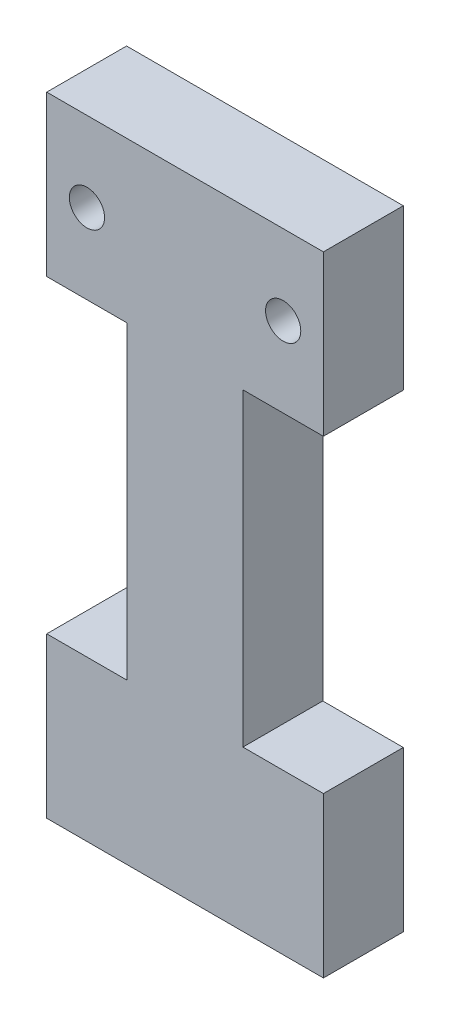
ISO-10303-21;
HEADER;
FILE_DESCRIPTION(('STEP AP214'),'2;1');
FILE_NAME('part.step','',(''),(''),'','','');
FILE_SCHEMA(('AUTOMOTIVE_DESIGN { 1 0 10303 214 1 1 1 1 }'));
ENDSEC;
DATA;
#1=APPLICATION_CONTEXT('core data for automotive mechanical design processes');
#2=APPLICATION_PROTOCOL_DEFINITION('international standard','automotive_design',2000,#1);
#3=PRODUCT_CONTEXT('',#1,'mechanical');
#4=PRODUCT('Part','Part','',(#3));
#5=PRODUCT_RELATED_PRODUCT_CATEGORY('part','',(#4));
#6=PRODUCT_DEFINITION_FORMATION('','',#4);
#7=PRODUCT_DEFINITION_CONTEXT('part definition',#1,'design');
#8=PRODUCT_DEFINITION('design','',#6,#7);
#9=PRODUCT_DEFINITION_SHAPE('','',#8);
#10=(LENGTH_UNIT() NAMED_UNIT(*) SI_UNIT(.MILLI.,.METRE.));
#11=(NAMED_UNIT(*) PLANE_ANGLE_UNIT() SI_UNIT($,.RADIAN.));
#12=(NAMED_UNIT(*) SI_UNIT($,.STERADIAN.) SOLID_ANGLE_UNIT());
#13=UNCERTAINTY_MEASURE_WITH_UNIT(LENGTH_MEASURE(1.E-05),#10,'distance_accuracy_value','');
#14=(GEOMETRIC_REPRESENTATION_CONTEXT(3) GLOBAL_UNCERTAINTY_ASSIGNED_CONTEXT((#13)) GLOBAL_UNIT_ASSIGNED_CONTEXT((#10,
#11,#12)) REPRESENTATION_CONTEXT('',''));
#15=CARTESIAN_POINT('',(0.,0.,0.));
#16=DIRECTION('',(0.,0.,1.));
#17=DIRECTION('',(1.,0.,0.));
#18=AXIS2_PLACEMENT_3D('',#15,#16,#17);
#19=CARTESIAN_POINT('',(0.,-25.,6.35));
#20=DIRECTION('',(0.,1.,0.));
#21=DIRECTION('',(-1.,0.,0.));
#22=AXIS2_PLACEMENT_3D('',#19,#20,#21);
#23=PLANE('',#22);
#24=DIRECTION('',(1.,0.,0.));
#25=VECTOR('',#24,1.);
#26=CARTESIAN_POINT('',(0.,-25.,0.));
#27=LINE('',#26,#25);
#28=CARTESIAN_POINT('',(-11.,-25.,0.));
#29=VERTEX_POINT('',#28);
#30=CARTESIAN_POINT('',(11.,-25.,0.));
#31=VERTEX_POINT('',#30);
#32=EDGE_CURVE('E166',#29,#31,#27,.T.);
#33=ORIENTED_EDGE('',*,*,#32,.T.);
#34=DIRECTION('',(0.,0.,-1.));
#35=VECTOR('',#34,1.);
#36=CARTESIAN_POINT('',(11.,-25.,6.35));
#37=LINE('',#36,#35);
#38=CARTESIAN_POINT('',(11.,-25.,6.35));
#39=VERTEX_POINT('',#38);
#40=EDGE_CURVE('E11',#39,#31,#37,.T.);
#41=ORIENTED_EDGE('',*,*,#40,.F.);
#42=DIRECTION('',(1.,0.,0.));
#43=VECTOR('',#42,1.);
#44=CARTESIAN_POINT('',(0.,-25.,6.35));
#45=LINE('',#44,#43);
#46=CARTESIAN_POINT('',(-11.,-25.,6.35));
#47=VERTEX_POINT('',#46);
#48=EDGE_CURVE('E202',#47,#39,#45,.T.);
#49=ORIENTED_EDGE('',*,*,#48,.F.);
#50=DIRECTION('',(0.,0.,-1.));
#51=VECTOR('',#50,1.);
#52=CARTESIAN_POINT('',(-11.,-25.,6.35));
#53=LINE('',#52,#51);
#54=EDGE_CURVE('E53',#47,#29,#53,.T.);
#55=ORIENTED_EDGE('',*,*,#54,.T.);
#56=EDGE_LOOP('',(#33,#41,#49,#55));
#57=FACE_BOUND('',#56,.T.);
#58=ADVANCED_FACE('F37',(#57),#23,.F.);
#59=CARTESIAN_POINT('',(11.,0.,6.35));
#60=DIRECTION('',(-1.,0.,0.));
#61=DIRECTION('',(0.,-1.,0.));
#62=AXIS2_PLACEMENT_3D('',#59,#60,#61);
#63=PLANE('',#62);
#64=DIRECTION('',(0.,1.,0.));
#65=VECTOR('',#64,1.);
#66=CARTESIAN_POINT('',(11.,0.,0.));
#67=LINE('',#66,#65);
#68=CARTESIAN_POINT('',(11.,-12.3,0.));
#69=VERTEX_POINT('',#68);
#70=EDGE_CURVE('E168',#31,#69,#67,.T.);
#71=ORIENTED_EDGE('',*,*,#70,.T.);
#72=DIRECTION('',(0.,0.,-1.));
#73=VECTOR('',#72,1.);
#74=CARTESIAN_POINT('',(11.,-12.3,6.35));
#75=LINE('',#74,#73);
#76=CARTESIAN_POINT('',(11.,-12.3,6.35));
#77=VERTEX_POINT('',#76);
#78=EDGE_CURVE('E45',#77,#69,#75,.T.);
#79=ORIENTED_EDGE('',*,*,#78,.F.);
#80=DIRECTION('',(0.,1.,0.));
#81=VECTOR('',#80,1.);
#82=CARTESIAN_POINT('',(11.,0.,6.35));
#83=LINE('',#82,#81);
#84=EDGE_CURVE('E104',#39,#77,#83,.T.);
#85=ORIENTED_EDGE('',*,*,#84,.F.);
#86=ORIENTED_EDGE('',*,*,#40,.T.);
#87=EDGE_LOOP('',(#71,#79,#85,#86));
#88=FACE_BOUND('',#87,.T.);
#89=ADVANCED_FACE('F225',(#88),#63,.F.);
#90=CARTESIAN_POINT('',(0.,-12.3,6.35));
#91=DIRECTION('',(0.,1.,0.));
#92=DIRECTION('',(0.,0.,1.));
#93=AXIS2_PLACEMENT_3D('',#90,#91,#92);
#94=PLANE('',#93);
#95=DIRECTION('',(1.,0.,0.));
#96=VECTOR('',#95,1.);
#97=CARTESIAN_POINT('',(0.,-12.3,0.));
#98=LINE('',#97,#96);
#99=CARTESIAN_POINT('',(4.6,-12.3,0.));
#100=VERTEX_POINT('',#99);
#101=EDGE_CURVE('E171',#100,#69,#98,.T.);
#102=ORIENTED_EDGE('',*,*,#101,.F.);
#103=DIRECTION('',(0.,0.,-1.));
#104=VECTOR('',#103,1.);
#105=CARTESIAN_POINT('',(4.6,-12.3,6.35));
#106=LINE('',#105,#104);
#107=CARTESIAN_POINT('',(4.6,-12.3,6.35));
#108=VERTEX_POINT('',#107);
#109=EDGE_CURVE('E218',#108,#100,#106,.T.);
#110=ORIENTED_EDGE('',*,*,#109,.F.);
#111=DIRECTION('',(1.,0.,0.));
#112=VECTOR('',#111,1.);
#113=CARTESIAN_POINT('',(0.,-12.3,6.35));
#114=LINE('',#113,#112);
#115=EDGE_CURVE('E224',#108,#77,#114,.T.);
#116=ORIENTED_EDGE('',*,*,#115,.T.);
#117=ORIENTED_EDGE('',*,*,#78,.T.);
#118=EDGE_LOOP('',(#102,#110,#116,#117));
#119=FACE_BOUND('',#118,.T.);
#120=ADVANCED_FACE('F222',(#119),#94,.T.);
#121=CARTESIAN_POINT('',(4.6,0.,6.35));
#122=DIRECTION('',(-1.,0.,0.));
#123=DIRECTION('',(0.,-1.,0.));
#124=AXIS2_PLACEMENT_3D('',#121,#122,#123);
#125=PLANE('',#124);
#126=DIRECTION('',(0.,1.,0.));
#127=VECTOR('',#126,1.);
#128=CARTESIAN_POINT('',(4.6,0.,0.));
#129=LINE('',#128,#127);
#130=CARTESIAN_POINT('',(4.6,12.3,0.));
#131=VERTEX_POINT('',#130);
#132=EDGE_CURVE('E174',#100,#131,#129,.T.);
#133=ORIENTED_EDGE('',*,*,#132,.T.);
#134=DIRECTION('',(0.,0.,-1.));
#135=VECTOR('',#134,1.);
#136=CARTESIAN_POINT('',(4.6,12.3,6.35));
#137=LINE('',#136,#135);
#138=CARTESIAN_POINT('',(4.6,12.3,6.35));
#139=VERTEX_POINT('',#138);
#140=EDGE_CURVE('E215',#139,#131,#137,.T.);
#141=ORIENTED_EDGE('',*,*,#140,.F.);
#142=DIRECTION('',(0.,1.,0.));
#143=VECTOR('',#142,1.);
#144=CARTESIAN_POINT('',(4.6,0.,6.35));
#145=LINE('',#144,#143);
#146=EDGE_CURVE('E244',#108,#139,#145,.T.);
#147=ORIENTED_EDGE('',*,*,#146,.F.);
#148=ORIENTED_EDGE('',*,*,#109,.T.);
#149=EDGE_LOOP('',(#133,#141,#147,#148));
#150=FACE_BOUND('',#149,.T.);
#151=ADVANCED_FACE('F234',(#150),#125,.F.);
#152=CARTESIAN_POINT('',(0.,12.3,6.35));
#153=DIRECTION('',(0.,1.,0.));
#154=DIRECTION('',(0.,0.,1.));
#155=AXIS2_PLACEMENT_3D('',#152,#153,#154);
#156=PLANE('',#155);
#157=DIRECTION('',(1.,0.,0.));
#158=VECTOR('',#157,1.);
#159=CARTESIAN_POINT('',(0.,12.3,0.));
#160=LINE('',#159,#158);
#161=CARTESIAN_POINT('',(11.,12.3,0.));
#162=VERTEX_POINT('',#161);
#163=EDGE_CURVE('E176',#131,#162,#160,.T.);
#164=ORIENTED_EDGE('',*,*,#163,.T.);
#165=DIRECTION('',(0.,0.,-1.));
#166=VECTOR('',#165,1.);
#167=CARTESIAN_POINT('',(11.,12.3,6.35));
#168=LINE('',#167,#166);
#169=CARTESIAN_POINT('',(11.,12.3,6.35));
#170=VERTEX_POINT('',#169);
#171=EDGE_CURVE('E213',#170,#162,#168,.T.);
#172=ORIENTED_EDGE('',*,*,#171,.F.);
#173=DIRECTION('',(1.,0.,0.));
#174=VECTOR('',#173,1.);
#175=CARTESIAN_POINT('',(0.,12.3,6.35));
#176=LINE('',#175,#174);
#177=EDGE_CURVE('E240',#139,#170,#176,.T.);
#178=ORIENTED_EDGE('',*,*,#177,.F.);
#179=ORIENTED_EDGE('',*,*,#140,.T.);
#180=EDGE_LOOP('',(#164,#172,#178,#179));
#181=FACE_BOUND('',#180,.T.);
#182=ADVANCED_FACE('F238',(#181),#156,.F.);
#183=CARTESIAN_POINT('',(11.,0.,6.35));
#184=DIRECTION('',(1.,0.,0.));
#185=DIRECTION('',(0.,1.,0.));
#186=AXIS2_PLACEMENT_3D('',#183,#184,#185);
#187=PLANE('',#186);
#188=DIRECTION('',(0.,-1.,0.));
#189=VECTOR('',#188,1.);
#190=CARTESIAN_POINT('',(11.,0.,0.));
#191=LINE('',#190,#189);
#192=CARTESIAN_POINT('',(11.,25.,0.));
#193=VERTEX_POINT('',#192);
#194=EDGE_CURVE('E179',#193,#162,#191,.T.);
#195=ORIENTED_EDGE('',*,*,#194,.F.);
#196=DIRECTION('',(0.,0.,-1.));
#197=VECTOR('',#196,1.);
#198=CARTESIAN_POINT('',(11.,25.,6.35));
#199=LINE('',#198,#197);
#200=CARTESIAN_POINT('',(11.,25.,6.35));
#201=VERTEX_POINT('',#200);
#202=EDGE_CURVE('E211',#201,#193,#199,.T.);
#203=ORIENTED_EDGE('',*,*,#202,.F.);
#204=DIRECTION('',(0.,-1.,0.));
#205=VECTOR('',#204,1.);
#206=CARTESIAN_POINT('',(11.,0.,6.35));
#207=LINE('',#206,#205);
#208=EDGE_CURVE('E243',#201,#170,#207,.T.);
#209=ORIENTED_EDGE('',*,*,#208,.T.);
#210=ORIENTED_EDGE('',*,*,#171,.T.);
#211=EDGE_LOOP('',(#195,#203,#209,#210));
#212=FACE_BOUND('',#211,.T.);
#213=ADVANCED_FACE('F290',(#212),#187,.T.);
#214=CARTESIAN_POINT('',(0.,25.,6.35));
#215=DIRECTION('',(0.,-1.,0.));
#216=DIRECTION('',(0.,0.,-1.));
#217=AXIS2_PLACEMENT_3D('',#214,#215,#216);
#218=PLANE('',#217);
#219=DIRECTION('',(-1.,0.,0.));
#220=VECTOR('',#219,1.);
#221=CARTESIAN_POINT('',(0.,25.,0.));
#222=LINE('',#221,#220);
#223=CARTESIAN_POINT('',(-11.,25.,0.));
#224=VERTEX_POINT('',#223);
#225=EDGE_CURVE('E182',#193,#224,#222,.T.);
#226=ORIENTED_EDGE('',*,*,#225,.T.);
#227=DIRECTION('',(0.,0.,-1.));
#228=VECTOR('',#227,1.);
#229=CARTESIAN_POINT('',(-11.,25.,6.35));
#230=LINE('',#229,#228);
#231=CARTESIAN_POINT('',(-11.,25.,6.35));
#232=VERTEX_POINT('',#231);
#233=EDGE_CURVE('E208',#232,#224,#230,.T.);
#234=ORIENTED_EDGE('',*,*,#233,.F.);
#235=DIRECTION('',(-1.,0.,0.));
#236=VECTOR('',#235,1.);
#237=CARTESIAN_POINT('',(0.,25.,6.35));
#238=LINE('',#237,#236);
#239=EDGE_CURVE('E246',#201,#232,#238,.T.);
#240=ORIENTED_EDGE('',*,*,#239,.F.);
#241=ORIENTED_EDGE('',*,*,#202,.T.);
#242=EDGE_LOOP('',(#226,#234,#240,#241));
#243=FACE_BOUND('',#242,.T.);
#244=ADVANCED_FACE('F293',(#243),#218,.F.);
#245=CARTESIAN_POINT('',(-11.,0.,6.35));
#246=DIRECTION('',(1.,0.,0.));
#247=DIRECTION('',(0.,1.,0.));
#248=AXIS2_PLACEMENT_3D('',#245,#246,#247);
#249=PLANE('',#248);
#250=DIRECTION('',(0.,-1.,0.));
#251=VECTOR('',#250,1.);
#252=CARTESIAN_POINT('',(-11.,0.,0.));
#253=LINE('',#252,#251);
#254=CARTESIAN_POINT('',(-11.,12.3,0.));
#255=VERTEX_POINT('',#254);
#256=EDGE_CURVE('E184',#224,#255,#253,.T.);
#257=ORIENTED_EDGE('',*,*,#256,.T.);
#258=DIRECTION('',(0.,0.,-1.));
#259=VECTOR('',#258,1.);
#260=CARTESIAN_POINT('',(-11.,12.3,6.35));
#261=LINE('',#260,#259);
#262=CARTESIAN_POINT('',(-11.,12.3,6.35));
#263=VERTEX_POINT('',#262);
#264=EDGE_CURVE('E206',#263,#255,#261,.T.);
#265=ORIENTED_EDGE('',*,*,#264,.F.);
#266=DIRECTION('',(0.,-1.,0.));
#267=VECTOR('',#266,1.);
#268=CARTESIAN_POINT('',(-11.,0.,6.35));
#269=LINE('',#268,#267);
#270=EDGE_CURVE('E155',#232,#263,#269,.T.);
#271=ORIENTED_EDGE('',*,*,#270,.F.);
#272=ORIENTED_EDGE('',*,*,#233,.T.);
#273=EDGE_LOOP('',(#257,#265,#271,#272));
#274=FACE_BOUND('',#273,.T.);
#275=ADVANCED_FACE('F256',(#274),#249,.F.);
#276=CARTESIAN_POINT('',(0.,12.3,6.35));
#277=DIRECTION('',(0.,-1.,0.));
#278=DIRECTION('',(1.,0.,0.));
#279=AXIS2_PLACEMENT_3D('',#276,#277,#278);
#280=PLANE('',#279);
#281=DIRECTION('',(-1.,0.,0.));
#282=VECTOR('',#281,1.);
#283=CARTESIAN_POINT('',(0.,12.3,0.));
#284=LINE('',#283,#282);
#285=CARTESIAN_POINT('',(-4.6,12.3,0.));
#286=VERTEX_POINT('',#285);
#287=EDGE_CURVE('E187',#286,#255,#284,.T.);
#288=ORIENTED_EDGE('',*,*,#287,.F.);
#289=DIRECTION('',(0.,0.,-1.));
#290=VECTOR('',#289,1.);
#291=CARTESIAN_POINT('',(-4.6,12.3,6.35));
#292=LINE('',#291,#290);
#293=CARTESIAN_POINT('',(-4.6,12.3,6.35));
#294=VERTEX_POINT('',#293);
#295=EDGE_CURVE('E141',#294,#286,#292,.T.);
#296=ORIENTED_EDGE('',*,*,#295,.F.);
#297=DIRECTION('',(-1.,0.,0.));
#298=VECTOR('',#297,1.);
#299=CARTESIAN_POINT('',(0.,12.3,6.35));
#300=LINE('',#299,#298);
#301=EDGE_CURVE('E153',#294,#263,#300,.T.);
#302=ORIENTED_EDGE('',*,*,#301,.T.);
#303=ORIENTED_EDGE('',*,*,#264,.T.);
#304=EDGE_LOOP('',(#288,#296,#302,#303));
#305=FACE_BOUND('',#304,.T.);
#306=ADVANCED_FACE('F260',(#305),#280,.T.);
#307=CARTESIAN_POINT('',(-4.6,0.,6.35));
#308=DIRECTION('',(-1.,0.,0.));
#309=DIRECTION('',(0.,-1.,0.));
#310=AXIS2_PLACEMENT_3D('',#307,#308,#309);
#311=PLANE('',#310);
#312=DIRECTION('',(0.,1.,0.));
#313=VECTOR('',#312,1.);
#314=CARTESIAN_POINT('',(-4.6,0.,0.));
#315=LINE('',#314,#313);
#316=CARTESIAN_POINT('',(-4.6,-12.3,0.));
#317=VERTEX_POINT('',#316);
#318=EDGE_CURVE('E138',#317,#286,#315,.T.);
#319=ORIENTED_EDGE('',*,*,#318,.F.);
#320=DIRECTION('',(0.,0.,-1.));
#321=VECTOR('',#320,1.);
#322=CARTESIAN_POINT('',(-4.6,-12.3,6.35));
#323=LINE('',#322,#321);
#324=CARTESIAN_POINT('',(-4.6,-12.3,6.35));
#325=VERTEX_POINT('',#324);
#326=EDGE_CURVE('E132',#325,#317,#323,.T.);
#327=ORIENTED_EDGE('',*,*,#326,.F.);
#328=DIRECTION('',(0.,1.,0.));
#329=VECTOR('',#328,1.);
#330=CARTESIAN_POINT('',(-4.6,0.,6.35));
#331=LINE('',#330,#329);
#332=EDGE_CURVE('E136',#325,#294,#331,.T.);
#333=ORIENTED_EDGE('',*,*,#332,.T.);
#334=ORIENTED_EDGE('',*,*,#295,.T.);
#335=EDGE_LOOP('',(#319,#327,#333,#334));
#336=FACE_BOUND('',#335,.T.);
#337=ADVANCED_FACE('F134',(#336),#311,.T.);
#338=CARTESIAN_POINT('',(0.,-12.3,6.35));
#339=DIRECTION('',(0.,-1.,0.));
#340=DIRECTION('',(0.,0.,-1.));
#341=AXIS2_PLACEMENT_3D('',#338,#339,#340);
#342=PLANE('',#341);
#343=DIRECTION('',(-1.,0.,0.));
#344=VECTOR('',#343,1.);
#345=CARTESIAN_POINT('',(0.,-12.3,0.));
#346=LINE('',#345,#344);
#347=CARTESIAN_POINT('',(-11.,-12.3,0.));
#348=VERTEX_POINT('',#347);
#349=EDGE_CURVE('E191',#317,#348,#346,.T.);
#350=ORIENTED_EDGE('',*,*,#349,.T.);
#351=DIRECTION('',(0.,0.,-1.));
#352=VECTOR('',#351,1.);
#353=CARTESIAN_POINT('',(-11.,-12.3,6.35));
#354=LINE('',#353,#352);
#355=CARTESIAN_POINT('',(-11.,-12.3,6.35));
#356=VERTEX_POINT('',#355);
#357=EDGE_CURVE('E92',#356,#348,#354,.T.);
#358=ORIENTED_EDGE('',*,*,#357,.F.);
#359=DIRECTION('',(-1.,0.,0.));
#360=VECTOR('',#359,1.);
#361=CARTESIAN_POINT('',(0.,-12.3,6.35));
#362=LINE('',#361,#360);
#363=EDGE_CURVE('E143',#325,#356,#362,.T.);
#364=ORIENTED_EDGE('',*,*,#363,.F.);
#365=ORIENTED_EDGE('',*,*,#326,.T.);
#366=EDGE_LOOP('',(#350,#358,#364,#365));
#367=FACE_BOUND('',#366,.T.);
#368=ADVANCED_FACE('F144',(#367),#342,.F.);
#369=CARTESIAN_POINT('',(7.8,18.65,6.35));
#370=DIRECTION('',(0.,0.,-1.));
#371=DIRECTION('',(-1.,0.,0.));
#372=AXIS2_PLACEMENT_3D('',#369,#370,#371);
#373=CYLINDRICAL_SURFACE('',#372,1.4);
#374=CARTESIAN_POINT('',(7.8,18.65,6.35));
#375=DIRECTION('',(0.,0.,1.));
#376=DIRECTION('',(1.,0.,0.));
#377=AXIS2_PLACEMENT_3D('',#374,#375,#376);
#378=CIRCLE('',#377,1.4);
#379=CARTESIAN_POINT('',(9.2,18.65,6.35));
#380=VERTEX_POINT('',#379);
#381=EDGE_CURVE('E160',#380,#380,#378,.T.);
#382=ORIENTED_EDGE('',*,*,#381,.T.);
#383=EDGE_LOOP('',(#382));
#384=FACE_BOUND('',#383,.T.);
#385=CARTESIAN_POINT('',(7.8,18.65,0.));
#386=DIRECTION('',(0.,0.,1.));
#387=DIRECTION('',(1.,0.,0.));
#388=AXIS2_PLACEMENT_3D('',#385,#386,#387);
#389=CIRCLE('',#388,1.4);
#390=CARTESIAN_POINT('',(9.2,18.65,0.));
#391=VERTEX_POINT('',#390);
#392=EDGE_CURVE('E196',#391,#391,#389,.T.);
#393=ORIENTED_EDGE('',*,*,#392,.F.);
#394=EDGE_LOOP('',(#393));
#395=FACE_BOUND('',#394,.T.);
#396=ADVANCED_FACE('F264',(#384,#395),#373,.F.);
#397=CARTESIAN_POINT('',(-11.,0.,6.35));
#398=DIRECTION('',(-1.,0.,0.));
#399=DIRECTION('',(0.,0.,1.));
#400=AXIS2_PLACEMENT_3D('',#397,#398,#399);
#401=PLANE('',#400);
#402=DIRECTION('',(0.,1.,0.));
#403=VECTOR('',#402,1.);
#404=CARTESIAN_POINT('',(-11.,0.,0.));
#405=LINE('',#404,#403);
#406=EDGE_CURVE('E193',#29,#348,#405,.T.);
#407=ORIENTED_EDGE('',*,*,#406,.F.);
#408=ORIENTED_EDGE('',*,*,#54,.F.);
#409=DIRECTION('',(0.,1.,0.));
#410=VECTOR('',#409,1.);
#411=CARTESIAN_POINT('',(-11.,0.,6.35));
#412=LINE('',#411,#410);
#413=EDGE_CURVE('E147',#47,#356,#412,.T.);
#414=ORIENTED_EDGE('',*,*,#413,.T.);
#415=ORIENTED_EDGE('',*,*,#357,.T.);
#416=EDGE_LOOP('',(#407,#408,#414,#415));
#417=FACE_BOUND('',#416,.T.);
#418=ADVANCED_FACE('F261',(#417),#401,.T.);
#419=CARTESIAN_POINT('',(-7.8,18.65,6.35));
#420=DIRECTION('',(0.,0.,-1.));
#421=DIRECTION('',(-1.,0.,0.));
#422=AXIS2_PLACEMENT_3D('',#419,#420,#421);
#423=CYLINDRICAL_SURFACE('',#422,1.4);
#424=CARTESIAN_POINT('',(-7.8,18.65,6.35));
#425=DIRECTION('',(0.,0.,1.));
#426=DIRECTION('',(1.,0.,0.));
#427=AXIS2_PLACEMENT_3D('',#424,#425,#426);
#428=CIRCLE('',#427,1.4);
#429=CARTESIAN_POINT('',(-6.4,18.65,6.35));
#430=VERTEX_POINT('',#429);
#431=EDGE_CURVE('E163',#430,#430,#428,.T.);
#432=ORIENTED_EDGE('',*,*,#431,.T.);
#433=EDGE_LOOP('',(#432));
#434=FACE_BOUND('',#433,.T.);
#435=CARTESIAN_POINT('',(-7.8,18.65,0.));
#436=DIRECTION('',(0.,0.,1.));
#437=DIRECTION('',(1.,0.,0.));
#438=AXIS2_PLACEMENT_3D('',#435,#436,#437);
#439=CIRCLE('',#438,1.4);
#440=CARTESIAN_POINT('',(-6.4,18.65,0.));
#441=VERTEX_POINT('',#440);
#442=EDGE_CURVE('E199',#441,#441,#439,.T.);
#443=ORIENTED_EDGE('',*,*,#442,.F.);
#444=EDGE_LOOP('',(#443));
#445=FACE_BOUND('',#444,.T.);
#446=ADVANCED_FACE('F263',(#434,#445),#423,.F.);
#447=CARTESIAN_POINT('',(0.,0.,6.35));
#448=DIRECTION('',(0.,0.,1.));
#449=DIRECTION('',(1.,0.,0.));
#450=AXIS2_PLACEMENT_3D('',#447,#448,#449);
#451=PLANE('',#450);
#452=ORIENTED_EDGE('',*,*,#48,.T.);
#453=ORIENTED_EDGE('',*,*,#84,.T.);
#454=ORIENTED_EDGE('',*,*,#115,.F.);
#455=ORIENTED_EDGE('',*,*,#146,.T.);
#456=ORIENTED_EDGE('',*,*,#177,.T.);
#457=ORIENTED_EDGE('',*,*,#208,.F.);
#458=ORIENTED_EDGE('',*,*,#239,.T.);
#459=ORIENTED_EDGE('',*,*,#270,.T.);
#460=ORIENTED_EDGE('',*,*,#301,.F.);
#461=ORIENTED_EDGE('',*,*,#332,.F.);
#462=ORIENTED_EDGE('',*,*,#363,.T.);
#463=ORIENTED_EDGE('',*,*,#413,.F.);
#464=EDGE_LOOP('',(#452,#453,#454,#455,#456,#457,#458,#459,#460,#461,#462,#463));
#465=FACE_BOUND('',#464,.T.);
#466=ORIENTED_EDGE('',*,*,#381,.F.);
#467=EDGE_LOOP('',(#466));
#468=FACE_BOUND('',#467,.T.);
#469=ORIENTED_EDGE('',*,*,#431,.F.);
#470=EDGE_LOOP('',(#469));
#471=FACE_BOUND('',#470,.T.);
#472=ADVANCED_FACE('F150',(#465,#468,#471),#451,.T.);
#473=CARTESIAN_POINT('',(0.,0.,0.));
#474=DIRECTION('',(0.,0.,1.));
#475=DIRECTION('',(1.,0.,0.));
#476=AXIS2_PLACEMENT_3D('',#473,#474,#475);
#477=PLANE('',#476);
#478=ORIENTED_EDGE('',*,*,#32,.F.);
#479=ORIENTED_EDGE('',*,*,#406,.T.);
#480=ORIENTED_EDGE('',*,*,#349,.F.);
#481=ORIENTED_EDGE('',*,*,#318,.T.);
#482=ORIENTED_EDGE('',*,*,#287,.T.);
#483=ORIENTED_EDGE('',*,*,#256,.F.);
#484=ORIENTED_EDGE('',*,*,#225,.F.);
#485=ORIENTED_EDGE('',*,*,#194,.T.);
#486=ORIENTED_EDGE('',*,*,#163,.F.);
#487=ORIENTED_EDGE('',*,*,#132,.F.);
#488=ORIENTED_EDGE('',*,*,#101,.T.);
#489=ORIENTED_EDGE('',*,*,#70,.F.);
#490=EDGE_LOOP('',(#478,#479,#480,#481,#482,#483,#484,#485,#486,#487,#488,#489));
#491=FACE_BOUND('',#490,.T.);
#492=ORIENTED_EDGE('',*,*,#392,.T.);
#493=EDGE_LOOP('',(#492));
#494=FACE_BOUND('',#493,.T.);
#495=ORIENTED_EDGE('',*,*,#442,.T.);
#496=EDGE_LOOP('',(#495));
#497=FACE_BOUND('',#496,.T.);
#498=ADVANCED_FACE('F229',(#491,#494,#497),#477,.F.);
#499=CLOSED_SHELL('',(#58,#89,#120,#151,#182,#213,#244,#275,#306,#337,#368,#396,#418,#446,#472,#498));
#500=MANIFOLD_SOLID_BREP('B2',#499);
#501=ADVANCED_BREP_SHAPE_REPRESENTATION('',(#18,#500),#14);
#502=SHAPE_DEFINITION_REPRESENTATION(#9,#501);
ENDSEC;
END-ISO-10303-21;
